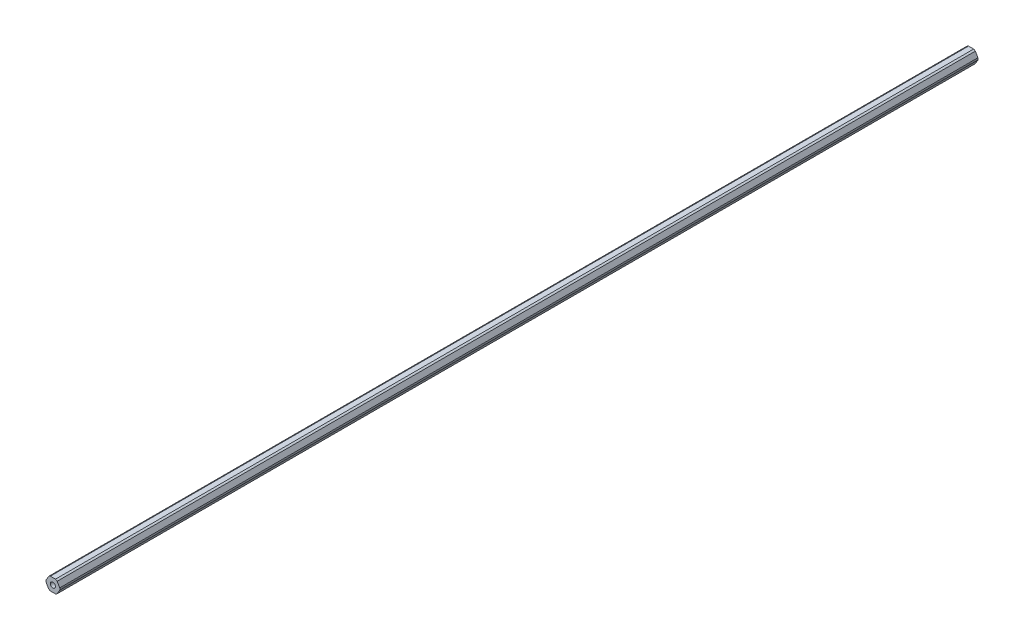
ISO-10303-21;
HEADER;
FILE_DESCRIPTION(('STEP AP214'),'2;1');
FILE_NAME('part.step','',(''),(''),'','','');
FILE_SCHEMA(('AUTOMOTIVE_DESIGN { 1 0 10303 214 1 1 1 1 }'));
ENDSEC;
DATA;
#1=APPLICATION_CONTEXT('core data for automotive mechanical design processes');
#2=APPLICATION_PROTOCOL_DEFINITION('international standard','automotive_design',2000,#1);
#3=PRODUCT_CONTEXT('',#1,'mechanical');
#4=PRODUCT('Part','Part','',(#3));
#5=PRODUCT_RELATED_PRODUCT_CATEGORY('part','',(#4));
#6=PRODUCT_DEFINITION_FORMATION('','',#4);
#7=PRODUCT_DEFINITION_CONTEXT('part definition',#1,'design');
#8=PRODUCT_DEFINITION('design','',#6,#7);
#9=PRODUCT_DEFINITION_SHAPE('','',#8);
#10=(LENGTH_UNIT() NAMED_UNIT(*) SI_UNIT(.MILLI.,.METRE.));
#11=(NAMED_UNIT(*) PLANE_ANGLE_UNIT() SI_UNIT($,.RADIAN.));
#12=(NAMED_UNIT(*) SI_UNIT($,.STERADIAN.) SOLID_ANGLE_UNIT());
#13=UNCERTAINTY_MEASURE_WITH_UNIT(LENGTH_MEASURE(1.E-05),#10,'distance_accuracy_value','');
#14=(GEOMETRIC_REPRESENTATION_CONTEXT(3) GLOBAL_UNCERTAINTY_ASSIGNED_CONTEXT((#13)) GLOBAL_UNIT_ASSIGNED_CONTEXT((#10,
#11,#12)) REPRESENTATION_CONTEXT('',''));
#15=CARTESIAN_POINT('',(0.,0.,0.));
#16=DIRECTION('',(0.,0.,1.));
#17=DIRECTION('',(1.,0.,0.));
#18=AXIS2_PLACEMENT_3D('',#15,#16,#17);
#19=CARTESIAN_POINT('',(0.,0.,-457.2));
#20=DIRECTION('',(0.,0.,1.));
#21=DIRECTION('',(1.,0.,0.));
#22=AXIS2_PLACEMENT_3D('',#19,#20,#21);
#23=CYLINDRICAL_SURFACE('',#22,2.55);
#24=DIRECTION('',(0.,0.,1.));
#25=VECTOR('',#24,1.);
#26=CARTESIAN_POINT('',(-2.55,0.,-457.2));
#27=LINE('',#26,#25);
#28=CARTESIAN_POINT('',(-2.55,0.,-457.2));
#29=VERTEX_POINT('',#28);
#30=CARTESIAN_POINT('',(-2.55,0.,457.2));
#31=VERTEX_POINT('',#30);
#32=EDGE_CURVE('E216',#29,#31,#27,.T.);
#33=ORIENTED_EDGE('',*,*,#32,.F.);
#34=CARTESIAN_POINT('',(0.,0.,-457.2));
#35=DIRECTION('',(0.,0.,1.));
#36=DIRECTION('',(1.,0.,0.));
#37=AXIS2_PLACEMENT_3D('',#34,#35,#36);
#38=CIRCLE('',#37,2.55);
#39=CARTESIAN_POINT('',(2.55,0.,-457.2));
#40=VERTEX_POINT('',#39);
#41=EDGE_CURVE('E10',#40,#29,#38,.T.);
#42=ORIENTED_EDGE('',*,*,#41,.F.);
#43=DIRECTION('',(0.,0.,1.));
#44=VECTOR('',#43,1.);
#45=CARTESIAN_POINT('',(2.55,0.,-457.2));
#46=LINE('',#45,#44);
#47=CARTESIAN_POINT('',(2.55,0.,457.2));
#48=VERTEX_POINT('',#47);
#49=EDGE_CURVE('E217',#40,#48,#46,.T.);
#50=ORIENTED_EDGE('',*,*,#49,.T.);
#51=CARTESIAN_POINT('',(0.,0.,457.2));
#52=DIRECTION('',(0.,0.,1.));
#53=DIRECTION('',(1.,0.,0.));
#54=AXIS2_PLACEMENT_3D('',#51,#52,#53);
#55=CIRCLE('',#54,2.55);
#56=EDGE_CURVE('E174',#48,#31,#55,.T.);
#57=ORIENTED_EDGE('',*,*,#56,.T.);
#58=EDGE_LOOP('',(#33,#42,#50,#57));
#59=FACE_BOUND('',#58,.T.);
#60=ADVANCED_FACE('F15',(#59),#23,.F.);
#61=CARTESIAN_POINT('',(0.,0.,-457.2));
#62=DIRECTION('',(0.,0.,1.));
#63=DIRECTION('',(1.,0.,0.));
#64=AXIS2_PLACEMENT_3D('',#61,#62,#63);
#65=CYLINDRICAL_SURFACE('',#64,6.87);
#66=DIRECTION('',(0.,0.,-1.));
#67=VECTOR('',#66,1.);
#68=CARTESIAN_POINT('',(4.24149521323254,5.40431479062105,-457.2));
#69=LINE('',#68,#67);
#70=CARTESIAN_POINT('',(4.24149521323254,5.40431479062105,457.2));
#71=VERTEX_POINT('',#70);
#72=CARTESIAN_POINT('',(4.24149521323254,5.40431479062105,-457.2));
#73=VERTEX_POINT('',#72);
#74=EDGE_CURVE('E177',#71,#73,#69,.T.);
#75=ORIENTED_EDGE('',*,*,#74,.T.);
#76=CARTESIAN_POINT('',(0.,0.,-457.2));
#77=DIRECTION('',(0.,0.,1.));
#78=DIRECTION('',(1.,0.,0.));
#79=AXIS2_PLACEMENT_3D('',#76,#77,#78);
#80=CIRCLE('',#79,6.87);
#81=CARTESIAN_POINT('',(2.55952629210952,6.3754,-457.2));
#82=VERTEX_POINT('',#81);
#83=EDGE_CURVE('E160',#73,#82,#80,.T.);
#84=ORIENTED_EDGE('',*,*,#83,.T.);
#85=DIRECTION('',(0.,0.,1.));
#86=VECTOR('',#85,1.);
#87=CARTESIAN_POINT('',(2.55952629210952,6.3754,-457.2));
#88=LINE('',#87,#86);
#89=CARTESIAN_POINT('',(2.55952629210952,6.3754,457.2));
#90=VERTEX_POINT('',#89);
#91=EDGE_CURVE('E198',#82,#90,#88,.T.);
#92=ORIENTED_EDGE('',*,*,#91,.T.);
#93=CARTESIAN_POINT('',(0.,0.,457.2));
#94=DIRECTION('',(0.,0.,1.));
#95=DIRECTION('',(1.,0.,0.));
#96=AXIS2_PLACEMENT_3D('',#93,#94,#95);
#97=CIRCLE('',#96,6.87);
#98=EDGE_CURVE('E179',#71,#90,#97,.T.);
#99=ORIENTED_EDGE('',*,*,#98,.F.);
#100=EDGE_LOOP('',(#75,#84,#92,#99));
#101=FACE_BOUND('',#100,.T.);
#102=ADVANCED_FACE('F178',(#101),#65,.T.);
#103=CARTESIAN_POINT('',(0.,0.,-457.2));
#104=DIRECTION('',(0.,0.,1.));
#105=DIRECTION('',(1.,0.,0.));
#106=AXIS2_PLACEMENT_3D('',#103,#104,#105);
#107=CYLINDRICAL_SURFACE('',#106,6.87);
#108=DIRECTION('',(0.,0.,-1.));
#109=VECTOR('',#108,1.);
#110=CARTESIAN_POINT('',(-2.55952629210953,6.3754,-457.2));
#111=LINE('',#110,#109);
#112=CARTESIAN_POINT('',(-2.55952629210953,6.3754,457.2));
#113=VERTEX_POINT('',#112);
#114=CARTESIAN_POINT('',(-2.55952629210953,6.3754,-457.2));
#115=VERTEX_POINT('',#114);
#116=EDGE_CURVE('E246',#113,#115,#111,.T.);
#117=ORIENTED_EDGE('',*,*,#116,.T.);
#118=CARTESIAN_POINT('',(0.,0.,-457.2));
#119=DIRECTION('',(0.,0.,1.));
#120=DIRECTION('',(1.,0.,0.));
#121=AXIS2_PLACEMENT_3D('',#118,#119,#120);
#122=CIRCLE('',#121,6.87);
#123=CARTESIAN_POINT('',(-4.24149521323255,5.40431479062105,-457.2));
#124=VERTEX_POINT('',#123);
#125=EDGE_CURVE('E26',#115,#124,#122,.T.);
#126=ORIENTED_EDGE('',*,*,#125,.T.);
#127=DIRECTION('',(0.,0.,1.));
#128=VECTOR('',#127,1.);
#129=CARTESIAN_POINT('',(-4.24149521323255,5.40431479062105,-457.2));
#130=LINE('',#129,#128);
#131=CARTESIAN_POINT('',(-4.24149521323255,5.40431479062105,457.2));
#132=VERTEX_POINT('',#131);
#133=EDGE_CURVE('E251',#124,#132,#130,.T.);
#134=ORIENTED_EDGE('',*,*,#133,.T.);
#135=CARTESIAN_POINT('',(0.,0.,457.2));
#136=DIRECTION('',(0.,0.,1.));
#137=DIRECTION('',(1.,0.,0.));
#138=AXIS2_PLACEMENT_3D('',#135,#136,#137);
#139=CIRCLE('',#138,6.87);
#140=EDGE_CURVE('E206',#113,#132,#139,.T.);
#141=ORIENTED_EDGE('',*,*,#140,.F.);
#142=EDGE_LOOP('',(#117,#126,#134,#141));
#143=FACE_BOUND('',#142,.T.);
#144=ADVANCED_FACE('F352',(#143),#107,.T.);
#145=CARTESIAN_POINT('',(0.,0.,-457.2));
#146=DIRECTION('',(0.,0.,1.));
#147=DIRECTION('',(1.,0.,0.));
#148=AXIS2_PLACEMENT_3D('',#145,#146,#147);
#149=CYLINDRICAL_SURFACE('',#148,6.87);
#150=DIRECTION('',(0.,0.,-1.));
#151=VECTOR('',#150,1.);
#152=CARTESIAN_POINT('',(-6.80102150534208,0.97108520937896,-457.2));
#153=LINE('',#152,#151);
#154=CARTESIAN_POINT('',(-6.80102150534208,0.97108520937896,457.2));
#155=VERTEX_POINT('',#154);
#156=CARTESIAN_POINT('',(-6.80102150534208,0.97108520937896,-457.2));
#157=VERTEX_POINT('',#156);
#158=EDGE_CURVE('E233',#155,#157,#153,.T.);
#159=ORIENTED_EDGE('',*,*,#158,.T.);
#160=CARTESIAN_POINT('',(0.,0.,-457.2));
#161=DIRECTION('',(0.,0.,1.));
#162=DIRECTION('',(1.,0.,0.));
#163=AXIS2_PLACEMENT_3D('',#160,#161,#162);
#164=CIRCLE('',#163,6.87);
#165=CARTESIAN_POINT('',(-6.80102150534208,-0.971085209378956,-457.2));
#166=VERTEX_POINT('',#165);
#167=EDGE_CURVE('E211',#157,#166,#164,.T.);
#168=ORIENTED_EDGE('',*,*,#167,.T.);
#169=DIRECTION('',(0.,0.,1.));
#170=VECTOR('',#169,1.);
#171=CARTESIAN_POINT('',(-6.80102150534208,-0.971085209378962,-457.2));
#172=LINE('',#171,#170);
#173=CARTESIAN_POINT('',(-6.80102150534208,-0.971085209378956,457.2));
#174=VERTEX_POINT('',#173);
#175=EDGE_CURVE('E232',#166,#174,#172,.T.);
#176=ORIENTED_EDGE('',*,*,#175,.T.);
#177=CARTESIAN_POINT('',(0.,0.,457.2));
#178=DIRECTION('',(0.,0.,1.));
#179=DIRECTION('',(1.,0.,0.));
#180=AXIS2_PLACEMENT_3D('',#177,#178,#179);
#181=CIRCLE('',#180,6.87);
#182=EDGE_CURVE('E277',#155,#174,#181,.T.);
#183=ORIENTED_EDGE('',*,*,#182,.F.);
#184=EDGE_LOOP('',(#159,#168,#176,#183));
#185=FACE_BOUND('',#184,.T.);
#186=ADVANCED_FACE('F397',(#185),#149,.T.);
#187=CARTESIAN_POINT('',(0.,0.,-457.2));
#188=DIRECTION('',(0.,0.,1.));
#189=DIRECTION('',(1.,0.,0.));
#190=AXIS2_PLACEMENT_3D('',#187,#188,#189);
#191=CYLINDRICAL_SURFACE('',#190,6.87);
#192=DIRECTION('',(0.,0.,-1.));
#193=VECTOR('',#192,1.);
#194=CARTESIAN_POINT('',(-4.24149521323255,-5.40431479062104,-457.2));
#195=LINE('',#194,#193);
#196=CARTESIAN_POINT('',(-4.24149521323254,-5.40431479062105,457.2));
#197=VERTEX_POINT('',#196);
#198=CARTESIAN_POINT('',(-4.24149521323254,-5.40431479062105,-457.2));
#199=VERTEX_POINT('',#198);
#200=EDGE_CURVE('E200',#197,#199,#195,.T.);
#201=ORIENTED_EDGE('',*,*,#200,.T.);
#202=CARTESIAN_POINT('',(0.,0.,-457.2));
#203=DIRECTION('',(0.,0.,1.));
#204=DIRECTION('',(1.,0.,0.));
#205=AXIS2_PLACEMENT_3D('',#202,#203,#204);
#206=CIRCLE('',#205,6.87);
#207=CARTESIAN_POINT('',(-2.55952629210953,-6.3754,-457.2));
#208=VERTEX_POINT('',#207);
#209=EDGE_CURVE('E144',#199,#208,#206,.T.);
#210=ORIENTED_EDGE('',*,*,#209,.T.);
#211=DIRECTION('',(0.,0.,1.));
#212=VECTOR('',#211,1.);
#213=CARTESIAN_POINT('',(-2.55952629210953,-6.3754,-457.2));
#214=LINE('',#213,#212);
#215=CARTESIAN_POINT('',(-2.55952629210953,-6.3754,457.2));
#216=VERTEX_POINT('',#215);
#217=EDGE_CURVE('E274',#208,#216,#214,.T.);
#218=ORIENTED_EDGE('',*,*,#217,.T.);
#219=CARTESIAN_POINT('',(0.,0.,457.2));
#220=DIRECTION('',(0.,0.,1.));
#221=DIRECTION('',(1.,0.,0.));
#222=AXIS2_PLACEMENT_3D('',#219,#220,#221);
#223=CIRCLE('',#222,6.87);
#224=EDGE_CURVE('E132',#197,#216,#223,.T.);
#225=ORIENTED_EDGE('',*,*,#224,.F.);
#226=EDGE_LOOP('',(#201,#210,#218,#225));
#227=FACE_BOUND('',#226,.T.);
#228=ADVANCED_FACE('F400',(#227),#191,.T.);
#229=CARTESIAN_POINT('',(0.,0.,-457.2));
#230=DIRECTION('',(0.,0.,1.));
#231=DIRECTION('',(1.,0.,0.));
#232=AXIS2_PLACEMENT_3D('',#229,#230,#231);
#233=CYLINDRICAL_SURFACE('',#232,6.87);
#234=DIRECTION('',(0.,0.,1.));
#235=VECTOR('',#234,1.);
#236=CARTESIAN_POINT('',(4.24149521323255,-5.40431479062104,-457.2));
#237=LINE('',#236,#235);
#238=CARTESIAN_POINT('',(4.24149521323254,-5.40431479062105,-457.2));
#239=VERTEX_POINT('',#238);
#240=CARTESIAN_POINT('',(4.24149521323254,-5.40431479062105,457.2));
#241=VERTEX_POINT('',#240);
#242=EDGE_CURVE('E282',#239,#241,#237,.T.);
#243=ORIENTED_EDGE('',*,*,#242,.T.);
#244=CARTESIAN_POINT('',(0.,0.,457.2));
#245=DIRECTION('',(0.,0.,1.));
#246=DIRECTION('',(1.,0.,0.));
#247=AXIS2_PLACEMENT_3D('',#244,#245,#246);
#248=CIRCLE('',#247,6.87);
#249=CARTESIAN_POINT('',(2.55952629210953,-6.3754,457.2));
#250=VERTEX_POINT('',#249);
#251=EDGE_CURVE('E41',#250,#241,#248,.T.);
#252=ORIENTED_EDGE('',*,*,#251,.F.);
#253=DIRECTION('',(0.,0.,-1.));
#254=VECTOR('',#253,1.);
#255=CARTESIAN_POINT('',(2.55952629210953,-6.3754,-457.2));
#256=LINE('',#255,#254);
#257=CARTESIAN_POINT('',(2.55952629210953,-6.3754,-457.2));
#258=VERTEX_POINT('',#257);
#259=EDGE_CURVE('E260',#250,#258,#256,.T.);
#260=ORIENTED_EDGE('',*,*,#259,.T.);
#261=CARTESIAN_POINT('',(0.,0.,-457.2));
#262=DIRECTION('',(0.,0.,1.));
#263=DIRECTION('',(1.,0.,0.));
#264=AXIS2_PLACEMENT_3D('',#261,#262,#263);
#265=CIRCLE('',#264,6.87);
#266=EDGE_CURVE('E239',#258,#239,#265,.T.);
#267=ORIENTED_EDGE('',*,*,#266,.T.);
#268=EDGE_LOOP('',(#243,#252,#260,#267));
#269=FACE_BOUND('',#268,.T.);
#270=ADVANCED_FACE('F17',(#269),#233,.T.);
#271=CARTESIAN_POINT('',(0.,0.,-457.2));
#272=DIRECTION('',(0.,0.,1.));
#273=DIRECTION('',(1.,0.,0.));
#274=AXIS2_PLACEMENT_3D('',#271,#272,#273);
#275=CYLINDRICAL_SURFACE('',#274,6.87);
#276=DIRECTION('',(0.,0.,1.));
#277=VECTOR('',#276,1.);
#278=CARTESIAN_POINT('',(6.87,0.,-457.2));
#279=LINE('',#278,#277);
#280=CARTESIAN_POINT('',(6.87,0.,-457.2));
#281=VERTEX_POINT('',#280);
#282=CARTESIAN_POINT('',(6.87,0.,457.2));
#283=VERTEX_POINT('',#282);
#284=EDGE_CURVE('E223',#281,#283,#279,.T.);
#285=ORIENTED_EDGE('',*,*,#284,.F.);
#286=CARTESIAN_POINT('',(0.,0.,-457.2));
#287=DIRECTION('',(0.,0.,1.));
#288=DIRECTION('',(1.,0.,0.));
#289=AXIS2_PLACEMENT_3D('',#286,#287,#288);
#290=CIRCLE('',#289,6.87);
#291=CARTESIAN_POINT('',(6.80102150534208,0.97108520937895,-457.2));
#292=VERTEX_POINT('',#291);
#293=EDGE_CURVE('E173',#281,#292,#290,.T.);
#294=ORIENTED_EDGE('',*,*,#293,.T.);
#295=DIRECTION('',(0.,0.,1.));
#296=VECTOR('',#295,1.);
#297=CARTESIAN_POINT('',(6.80102150534208,0.971085209378949,-457.2));
#298=LINE('',#297,#296);
#299=CARTESIAN_POINT('',(6.80102150534208,0.97108520937895,457.2));
#300=VERTEX_POINT('',#299);
#301=EDGE_CURVE('E187',#292,#300,#298,.T.);
#302=ORIENTED_EDGE('',*,*,#301,.T.);
#303=CARTESIAN_POINT('',(0.,0.,457.2));
#304=DIRECTION('',(0.,0.,1.));
#305=DIRECTION('',(1.,0.,0.));
#306=AXIS2_PLACEMENT_3D('',#303,#304,#305);
#307=CIRCLE('',#306,6.87);
#308=EDGE_CURVE('E287',#283,#300,#307,.T.);
#309=ORIENTED_EDGE('',*,*,#308,.F.);
#310=EDGE_LOOP('',(#285,#294,#302,#309));
#311=FACE_BOUND('',#310,.T.);
#312=ADVANCED_FACE('F333',(#311),#275,.T.);
#313=CARTESIAN_POINT('',(0.,0.,-457.2));
#314=DIRECTION('',(0.,0.,1.));
#315=DIRECTION('',(1.,0.,0.));
#316=AXIS2_PLACEMENT_3D('',#313,#314,#315);
#317=PLANE('',#316);
#318=ORIENTED_EDGE('',*,*,#41,.T.);
#319=CARTESIAN_POINT('',(0.,0.,-457.2));
#320=DIRECTION('',(0.,0.,1.));
#321=DIRECTION('',(1.,0.,0.));
#322=AXIS2_PLACEMENT_3D('',#319,#320,#321);
#323=CIRCLE('',#322,2.55);
#324=EDGE_CURVE('E212',#29,#40,#323,.T.);
#325=ORIENTED_EDGE('',*,*,#324,.T.);
#326=EDGE_LOOP('',(#318,#325));
#327=FACE_BOUND('',#326,.T.);
#328=ORIENTED_EDGE('',*,*,#83,.F.);
#329=DIRECTION('',(-0.5,0.866025403784439,0.));
#330=VECTOR('',#329,1.);
#331=CARTESIAN_POINT('',(7.36167781238308,0.,-457.2));
#332=LINE('',#331,#330);
#333=EDGE_CURVE('E164',#292,#73,#332,.T.);
#334=ORIENTED_EDGE('',*,*,#333,.F.);
#335=ORIENTED_EDGE('',*,*,#293,.F.);
#336=CARTESIAN_POINT('',(0.,0.,-457.2));
#337=DIRECTION('',(0.,0.,1.));
#338=DIRECTION('',(1.,0.,0.));
#339=AXIS2_PLACEMENT_3D('',#336,#337,#338);
#340=CIRCLE('',#339,6.87);
#341=CARTESIAN_POINT('',(6.80102150534208,-0.971085209378955,-457.2));
#342=VERTEX_POINT('',#341);
#343=EDGE_CURVE('E221',#342,#281,#340,.T.);
#344=ORIENTED_EDGE('',*,*,#343,.F.);
#345=DIRECTION('',(0.5,0.866025403784439,0.));
#346=VECTOR('',#345,1.);
#347=CARTESIAN_POINT('',(3.68083890619154,-6.3754,-457.2));
#348=LINE('',#347,#346);
#349=EDGE_CURVE('E278',#239,#342,#348,.T.);
#350=ORIENTED_EDGE('',*,*,#349,.F.);
#351=ORIENTED_EDGE('',*,*,#266,.F.);
#352=DIRECTION('',(1.,0.,0.));
#353=VECTOR('',#352,1.);
#354=CARTESIAN_POINT('',(-3.68083890619154,-6.3754,-457.2));
#355=LINE('',#354,#353);
#356=EDGE_CURVE('E270',#208,#258,#355,.T.);
#357=ORIENTED_EDGE('',*,*,#356,.F.);
#358=ORIENTED_EDGE('',*,*,#209,.F.);
#359=DIRECTION('',(0.5,-0.866025403784439,0.));
#360=VECTOR('',#359,1.);
#361=CARTESIAN_POINT('',(-7.36167781238308,0.,-457.2));
#362=LINE('',#361,#360);
#363=EDGE_CURVE('E204',#166,#199,#362,.T.);
#364=ORIENTED_EDGE('',*,*,#363,.F.);
#365=ORIENTED_EDGE('',*,*,#167,.F.);
#366=DIRECTION('',(-0.5,-0.866025403784439,0.));
#367=VECTOR('',#366,1.);
#368=CARTESIAN_POINT('',(-3.68083890619154,6.3754,-457.2));
#369=LINE('',#368,#367);
#370=EDGE_CURVE('E255',#124,#157,#369,.T.);
#371=ORIENTED_EDGE('',*,*,#370,.F.);
#372=ORIENTED_EDGE('',*,*,#125,.F.);
#373=DIRECTION('',(-1.,0.,0.));
#374=VECTOR('',#373,1.);
#375=CARTESIAN_POINT('',(3.68083890619154,6.3754,-457.2));
#376=LINE('',#375,#374);
#377=EDGE_CURVE('E168',#82,#115,#376,.T.);
#378=ORIENTED_EDGE('',*,*,#377,.F.);
#379=EDGE_LOOP('',(#328,#334,#335,#344,#350,#351,#357,#358,#364,#365,#371,#372,#378));
#380=FACE_BOUND('',#379,.T.);
#381=ADVANCED_FACE('F162',(#327,#380),#317,.F.);
#382=CARTESIAN_POINT('',(0.,0.,457.2));
#383=DIRECTION('',(0.,0.,1.));
#384=DIRECTION('',(1.,0.,0.));
#385=AXIS2_PLACEMENT_3D('',#382,#383,#384);
#386=PLANE('',#385);
#387=ORIENTED_EDGE('',*,*,#56,.F.);
#388=CARTESIAN_POINT('',(0.,0.,457.2));
#389=DIRECTION('',(0.,0.,1.));
#390=DIRECTION('',(1.,0.,0.));
#391=AXIS2_PLACEMENT_3D('',#388,#389,#390);
#392=CIRCLE('',#391,2.55);
#393=EDGE_CURVE('E222',#31,#48,#392,.T.);
#394=ORIENTED_EDGE('',*,*,#393,.F.);
#395=EDGE_LOOP('',(#387,#394));
#396=FACE_BOUND('',#395,.T.);
#397=DIRECTION('',(-0.5,0.866025403784439,0.));
#398=VECTOR('',#397,1.);
#399=CARTESIAN_POINT('',(7.36167781238308,0.,457.2));
#400=LINE('',#399,#398);
#401=EDGE_CURVE('E19',#300,#71,#400,.T.);
#402=ORIENTED_EDGE('',*,*,#401,.T.);
#403=ORIENTED_EDGE('',*,*,#98,.T.);
#404=DIRECTION('',(-1.,0.,0.));
#405=VECTOR('',#404,1.);
#406=CARTESIAN_POINT('',(3.68083890619154,6.3754,457.2));
#407=LINE('',#406,#405);
#408=EDGE_CURVE('E250',#90,#113,#407,.T.);
#409=ORIENTED_EDGE('',*,*,#408,.T.);
#410=ORIENTED_EDGE('',*,*,#140,.T.);
#411=DIRECTION('',(-0.5,-0.866025403784439,0.));
#412=VECTOR('',#411,1.);
#413=CARTESIAN_POINT('',(-3.68083890619154,6.3754,457.2));
#414=LINE('',#413,#412);
#415=EDGE_CURVE('E228',#132,#155,#414,.T.);
#416=ORIENTED_EDGE('',*,*,#415,.T.);
#417=ORIENTED_EDGE('',*,*,#182,.T.);
#418=DIRECTION('',(0.5,-0.866025403784439,0.));
#419=VECTOR('',#418,1.);
#420=CARTESIAN_POINT('',(-7.36167781238308,0.,457.2));
#421=LINE('',#420,#419);
#422=EDGE_CURVE('E203',#174,#197,#421,.T.);
#423=ORIENTED_EDGE('',*,*,#422,.T.);
#424=ORIENTED_EDGE('',*,*,#224,.T.);
#425=DIRECTION('',(1.,0.,0.));
#426=VECTOR('',#425,1.);
#427=CARTESIAN_POINT('',(-3.68083890619154,-6.3754,457.2));
#428=LINE('',#427,#426);
#429=EDGE_CURVE('E207',#216,#250,#428,.T.);
#430=ORIENTED_EDGE('',*,*,#429,.T.);
#431=ORIENTED_EDGE('',*,*,#251,.T.);
#432=DIRECTION('',(0.5,0.866025403784439,0.));
#433=VECTOR('',#432,1.);
#434=CARTESIAN_POINT('',(3.68083890619154,-6.3754,457.2));
#435=LINE('',#434,#433);
#436=CARTESIAN_POINT('',(6.80102150534208,-0.971085209378955,457.2));
#437=VERTEX_POINT('',#436);
#438=EDGE_CURVE('E194',#241,#437,#435,.T.);
#439=ORIENTED_EDGE('',*,*,#438,.T.);
#440=CARTESIAN_POINT('',(0.,0.,457.2));
#441=DIRECTION('',(0.,0.,1.));
#442=DIRECTION('',(1.,0.,0.));
#443=AXIS2_PLACEMENT_3D('',#440,#441,#442);
#444=CIRCLE('',#443,6.87);
#445=EDGE_CURVE('E227',#437,#283,#444,.T.);
#446=ORIENTED_EDGE('',*,*,#445,.T.);
#447=ORIENTED_EDGE('',*,*,#308,.T.);
#448=EDGE_LOOP('',(#402,#403,#409,#410,#416,#417,#423,#424,#430,#431,#439,#446,#447));
#449=FACE_BOUND('',#448,.T.);
#450=ADVANCED_FACE('F322',(#396,#449),#386,.T.);
#451=CARTESIAN_POINT('',(-3.68083890619154,-6.3754,457.2));
#452=DIRECTION('',(0.,1.,0.));
#453=DIRECTION('',(1.,0.,0.));
#454=AXIS2_PLACEMENT_3D('',#451,#452,#453);
#455=PLANE('',#454);
#456=ORIENTED_EDGE('',*,*,#217,.F.);
#457=ORIENTED_EDGE('',*,*,#356,.T.);
#458=ORIENTED_EDGE('',*,*,#259,.F.);
#459=ORIENTED_EDGE('',*,*,#429,.F.);
#460=EDGE_LOOP('',(#456,#457,#458,#459));
#461=FACE_BOUND('',#460,.T.);
#462=ADVANCED_FACE('F382',(#461),#455,.F.);
#463=CARTESIAN_POINT('',(-7.36167781238308,0.,457.2));
#464=DIRECTION('',(0.866025403784439,0.5,0.));
#465=DIRECTION('',(0.,0.,-1.));
#466=AXIS2_PLACEMENT_3D('',#463,#464,#465);
#467=PLANE('',#466);
#468=ORIENTED_EDGE('',*,*,#175,.F.);
#469=ORIENTED_EDGE('',*,*,#363,.T.);
#470=ORIENTED_EDGE('',*,*,#200,.F.);
#471=ORIENTED_EDGE('',*,*,#422,.F.);
#472=EDGE_LOOP('',(#468,#469,#470,#471));
#473=FACE_BOUND('',#472,.T.);
#474=ADVANCED_FACE('F406',(#473),#467,.F.);
#475=CARTESIAN_POINT('',(-3.68083890619154,6.3754,457.2));
#476=DIRECTION('',(0.866025403784439,-0.5,0.));
#477=DIRECTION('',(0.,0.,-1.));
#478=AXIS2_PLACEMENT_3D('',#475,#476,#477);
#479=PLANE('',#478);
#480=ORIENTED_EDGE('',*,*,#133,.F.);
#481=ORIENTED_EDGE('',*,*,#370,.T.);
#482=ORIENTED_EDGE('',*,*,#158,.F.);
#483=ORIENTED_EDGE('',*,*,#415,.F.);
#484=EDGE_LOOP('',(#480,#481,#482,#483));
#485=FACE_BOUND('',#484,.T.);
#486=ADVANCED_FACE('F351',(#485),#479,.F.);
#487=CARTESIAN_POINT('',(3.68083890619154,6.3754,457.2));
#488=DIRECTION('',(0.,-1.,0.));
#489=DIRECTION('',(0.,0.,-1.));
#490=AXIS2_PLACEMENT_3D('',#487,#488,#489);
#491=PLANE('',#490);
#492=ORIENTED_EDGE('',*,*,#91,.F.);
#493=ORIENTED_EDGE('',*,*,#377,.T.);
#494=ORIENTED_EDGE('',*,*,#116,.F.);
#495=ORIENTED_EDGE('',*,*,#408,.F.);
#496=EDGE_LOOP('',(#492,#493,#494,#495));
#497=FACE_BOUND('',#496,.T.);
#498=ADVANCED_FACE('F342',(#497),#491,.F.);
#499=CARTESIAN_POINT('',(7.36167781238308,0.,457.2));
#500=DIRECTION('',(-0.866025403784439,-0.5,0.));
#501=DIRECTION('',(-0.5,0.866025403784439,0.));
#502=AXIS2_PLACEMENT_3D('',#499,#500,#501);
#503=PLANE('',#502);
#504=ORIENTED_EDGE('',*,*,#301,.F.);
#505=ORIENTED_EDGE('',*,*,#333,.T.);
#506=ORIENTED_EDGE('',*,*,#74,.F.);
#507=ORIENTED_EDGE('',*,*,#401,.F.);
#508=EDGE_LOOP('',(#504,#505,#506,#507));
#509=FACE_BOUND('',#508,.T.);
#510=ADVANCED_FACE('F185',(#509),#503,.F.);
#511=CARTESIAN_POINT('',(3.68083890619154,-6.3754,457.2));
#512=DIRECTION('',(-0.866025403784439,0.5,0.));
#513=DIRECTION('',(0.,0.,1.));
#514=AXIS2_PLACEMENT_3D('',#511,#512,#513);
#515=PLANE('',#514);
#516=ORIENTED_EDGE('',*,*,#242,.F.);
#517=ORIENTED_EDGE('',*,*,#349,.T.);
#518=DIRECTION('',(0.,0.,-1.));
#519=VECTOR('',#518,1.);
#520=CARTESIAN_POINT('',(6.80102150534208,-0.971085209378962,-457.2));
#521=LINE('',#520,#519);
#522=EDGE_CURVE('E269',#437,#342,#521,.T.);
#523=ORIENTED_EDGE('',*,*,#522,.F.);
#524=ORIENTED_EDGE('',*,*,#438,.F.);
#525=EDGE_LOOP('',(#516,#517,#523,#524));
#526=FACE_BOUND('',#525,.T.);
#527=ADVANCED_FACE('F326',(#526),#515,.F.);
#528=CARTESIAN_POINT('',(0.,0.,-457.2));
#529=DIRECTION('',(0.,0.,1.));
#530=DIRECTION('',(1.,0.,0.));
#531=AXIS2_PLACEMENT_3D('',#528,#529,#530);
#532=CYLINDRICAL_SURFACE('',#531,6.87);
#533=ORIENTED_EDGE('',*,*,#343,.T.);
#534=ORIENTED_EDGE('',*,*,#284,.T.);
#535=ORIENTED_EDGE('',*,*,#445,.F.);
#536=ORIENTED_EDGE('',*,*,#522,.T.);
#537=EDGE_LOOP('',(#533,#534,#535,#536));
#538=FACE_BOUND('',#537,.T.);
#539=ADVANCED_FACE('F330',(#538),#532,.T.);
#540=CARTESIAN_POINT('',(0.,0.,-457.2));
#541=DIRECTION('',(0.,0.,1.));
#542=DIRECTION('',(1.,0.,0.));
#543=AXIS2_PLACEMENT_3D('',#540,#541,#542);
#544=CYLINDRICAL_SURFACE('',#543,2.55);
#545=ORIENTED_EDGE('',*,*,#324,.F.);
#546=ORIENTED_EDGE('',*,*,#32,.T.);
#547=ORIENTED_EDGE('',*,*,#393,.T.);
#548=ORIENTED_EDGE('',*,*,#49,.F.);
#549=EDGE_LOOP('',(#545,#546,#547,#548));
#550=FACE_BOUND('',#549,.T.);
#551=ADVANCED_FACE('F373',(#550),#544,.F.);
#552=CLOSED_SHELL('',(#60,#102,#144,#186,#228,#270,#312,#381,#450,#462,#474,#486,#498,#510,#527,
#539,#551));
#553=MANIFOLD_SOLID_BREP('B1',#552);
#554=ADVANCED_BREP_SHAPE_REPRESENTATION('',(#18,#553),#14);
#555=SHAPE_DEFINITION_REPRESENTATION(#9,#554);
ENDSEC;
END-ISO-10303-21;
